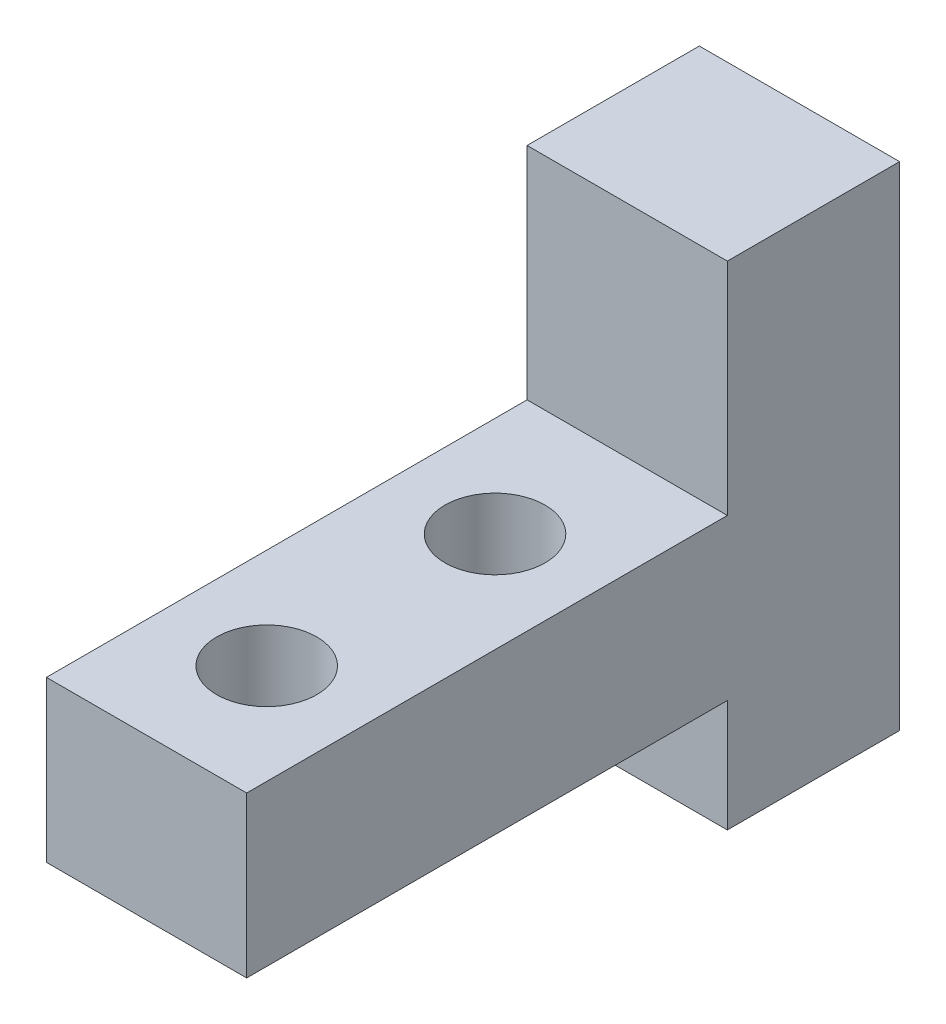
ISO-10303-21;
HEADER;
FILE_DESCRIPTION(('STEP AP214'),'2;1');
FILE_NAME('part.step','',(''),(''),'','','');
FILE_SCHEMA(('AUTOMOTIVE_DESIGN { 1 0 10303 214 1 1 1 1 }'));
ENDSEC;
DATA;
#1=APPLICATION_CONTEXT('core data for automotive mechanical design processes');
#2=APPLICATION_PROTOCOL_DEFINITION('international standard','automotive_design',2000,#1);
#3=PRODUCT_CONTEXT('',#1,'mechanical');
#4=PRODUCT('Part','Part','',(#3));
#5=PRODUCT_RELATED_PRODUCT_CATEGORY('part','',(#4));
#6=PRODUCT_DEFINITION_FORMATION('','',#4);
#7=PRODUCT_DEFINITION_CONTEXT('part definition',#1,'design');
#8=PRODUCT_DEFINITION('design','',#6,#7);
#9=PRODUCT_DEFINITION_SHAPE('','',#8);
#10=(LENGTH_UNIT() NAMED_UNIT(*) SI_UNIT(.MILLI.,.METRE.));
#11=(NAMED_UNIT(*) PLANE_ANGLE_UNIT() SI_UNIT($,.RADIAN.));
#12=(NAMED_UNIT(*) SI_UNIT($,.STERADIAN.) SOLID_ANGLE_UNIT());
#13=UNCERTAINTY_MEASURE_WITH_UNIT(LENGTH_MEASURE(1.E-05),#10,'distance_accuracy_value','');
#14=(GEOMETRIC_REPRESENTATION_CONTEXT(3) GLOBAL_UNCERTAINTY_ASSIGNED_CONTEXT((#13)) GLOBAL_UNIT_ASSIGNED_CONTEXT((#10,
#11,#12)) REPRESENTATION_CONTEXT('',''));
#15=CARTESIAN_POINT('',(0.,0.,0.));
#16=DIRECTION('',(0.,0.,1.));
#17=DIRECTION('',(1.,0.,0.));
#18=AXIS2_PLACEMENT_3D('',#15,#16,#17);
#19=CARTESIAN_POINT('',(0.,-2.1,10.5));
#20=DIRECTION('',(0.,-1.,0.));
#21=DIRECTION('',(-1.,0.,0.));
#22=AXIS2_PLACEMENT_3D('',#19,#20,#21);
#23=CYLINDRICAL_SURFACE('',#22,1.25);
#24=CARTESIAN_POINT('',(0.,-7.6,10.5));
#25=DIRECTION('',(0.,-1.,0.));
#26=DIRECTION('',(0.,0.,1.));
#27=AXIS2_PLACEMENT_3D('',#24,#25,#26);
#28=CIRCLE('',#27,1.25);
#29=CARTESIAN_POINT('',(-1.25,-7.6,10.5));
#30=VERTEX_POINT('',#29);
#31=EDGE_CURVE('E42',#30,#30,#28,.T.);
#32=ORIENTED_EDGE('',*,*,#31,.F.);
#33=EDGE_LOOP('',(#32));
#34=FACE_BOUND('',#33,.T.);
#35=CARTESIAN_POINT('',(0.,-11.6,10.5));
#36=DIRECTION('',(0.,-1.,0.));
#37=DIRECTION('',(-1.,0.,0.));
#38=AXIS2_PLACEMENT_3D('',#35,#36,#37);
#39=CIRCLE('',#38,1.25);
#40=CARTESIAN_POINT('',(-1.25,-11.6,10.5));
#41=VERTEX_POINT('',#40);
#42=EDGE_CURVE('E10',#41,#41,#39,.T.);
#43=ORIENTED_EDGE('',*,*,#42,.T.);
#44=EDGE_LOOP('',(#43));
#45=FACE_BOUND('',#44,.T.);
#46=ADVANCED_FACE('F18',(#34,#45),#23,.F.);
#47=CARTESIAN_POINT('',(0.,-2.1,16.2));
#48=DIRECTION('',(0.,-1.,0.));
#49=DIRECTION('',(-1.,0.,0.));
#50=AXIS2_PLACEMENT_3D('',#47,#48,#49);
#51=CYLINDRICAL_SURFACE('',#50,1.25);
#52=CARTESIAN_POINT('',(0.,-7.6,16.2));
#53=DIRECTION('',(0.,-1.,0.));
#54=DIRECTION('',(0.,0.,1.));
#55=AXIS2_PLACEMENT_3D('',#52,#53,#54);
#56=CIRCLE('',#55,1.25);
#57=CARTESIAN_POINT('',(-1.25000000000002,-7.6,16.2));
#58=VERTEX_POINT('',#57);
#59=EDGE_CURVE('E158',#58,#58,#56,.T.);
#60=ORIENTED_EDGE('',*,*,#59,.F.);
#61=EDGE_LOOP('',(#60));
#62=FACE_BOUND('',#61,.T.);
#63=CARTESIAN_POINT('',(0.,-11.6,16.2));
#64=DIRECTION('',(0.,-1.,0.));
#65=DIRECTION('',(-1.,0.,0.));
#66=AXIS2_PLACEMENT_3D('',#63,#64,#65);
#67=CIRCLE('',#66,1.25);
#68=CARTESIAN_POINT('',(-1.25000000000002,-11.6,16.2));
#69=VERTEX_POINT('',#68);
#70=EDGE_CURVE('E29',#69,#69,#67,.T.);
#71=ORIENTED_EDGE('',*,*,#70,.T.);
#72=EDGE_LOOP('',(#71));
#73=FACE_BOUND('',#72,.T.);
#74=ADVANCED_FACE('F277',(#62,#73),#51,.F.);
#75=CARTESIAN_POINT('',(-2.5,-11.6,7.2));
#76=DIRECTION('',(0.,0.,-1.));
#77=DIRECTION('',(0.,-1.,0.));
#78=AXIS2_PLACEMENT_3D('',#75,#76,#77);
#79=PLANE('',#78);
#80=DIRECTION('',(0.,1.,0.));
#81=VECTOR('',#80,1.);
#82=CARTESIAN_POINT('',(2.5,-11.6,7.2));
#83=LINE('',#82,#81);
#84=CARTESIAN_POINT('',(2.5,-14.4,7.2));
#85=VERTEX_POINT('',#84);
#86=CARTESIAN_POINT('',(2.5,-11.6,7.2));
#87=VERTEX_POINT('',#86);
#88=EDGE_CURVE('E171',#85,#87,#83,.T.);
#89=ORIENTED_EDGE('',*,*,#88,.T.);
#90=DIRECTION('',(1.,0.,0.));
#91=VECTOR('',#90,1.);
#92=CARTESIAN_POINT('',(-2.5,-11.6,7.2));
#93=LINE('',#92,#91);
#94=CARTESIAN_POINT('',(-2.5,-11.6,7.2));
#95=VERTEX_POINT('',#94);
#96=EDGE_CURVE('E189',#95,#87,#93,.T.);
#97=ORIENTED_EDGE('',*,*,#96,.F.);
#98=DIRECTION('',(0.,1.,0.));
#99=VECTOR('',#98,1.);
#100=CARTESIAN_POINT('',(-2.5,-11.6,7.2));
#101=LINE('',#100,#99);
#102=CARTESIAN_POINT('',(-2.5,-14.4,7.2));
#103=VERTEX_POINT('',#102);
#104=EDGE_CURVE('E167',#103,#95,#101,.T.);
#105=ORIENTED_EDGE('',*,*,#104,.F.);
#106=DIRECTION('',(1.,0.,0.));
#107=VECTOR('',#106,1.);
#108=CARTESIAN_POINT('',(-2.5,-14.4,7.2));
#109=LINE('',#108,#107);
#110=EDGE_CURVE('E168',#103,#85,#109,.T.);
#111=ORIENTED_EDGE('',*,*,#110,.T.);
#112=EDGE_LOOP('',(#89,#97,#105,#111));
#113=FACE_BOUND('',#112,.T.);
#114=ADVANCED_FACE('F281',(#113),#79,.F.);
#115=CARTESIAN_POINT('',(-2.5,-11.6,19.2));
#116=DIRECTION('',(0.,1.,0.));
#117=DIRECTION('',(0.,0.,1.));
#118=AXIS2_PLACEMENT_3D('',#115,#116,#117);
#119=PLANE('',#118);
#120=DIRECTION('',(0.,0.,1.));
#121=VECTOR('',#120,1.);
#122=CARTESIAN_POINT('',(2.5,-11.6,19.2));
#123=LINE('',#122,#121);
#124=CARTESIAN_POINT('',(2.5,-11.6,19.2));
#125=VERTEX_POINT('',#124);
#126=EDGE_CURVE('E172',#87,#125,#123,.T.);
#127=ORIENTED_EDGE('',*,*,#126,.T.);
#128=DIRECTION('',(1.,0.,0.));
#129=VECTOR('',#128,1.);
#130=CARTESIAN_POINT('',(-2.5,-11.6,19.2));
#131=LINE('',#130,#129);
#132=CARTESIAN_POINT('',(-2.5,-11.6,19.2));
#133=VERTEX_POINT('',#132);
#134=EDGE_CURVE('E208',#133,#125,#131,.T.);
#135=ORIENTED_EDGE('',*,*,#134,.F.);
#136=DIRECTION('',(0.,0.,1.));
#137=VECTOR('',#136,1.);
#138=CARTESIAN_POINT('',(-2.5,-11.6,19.2));
#139=LINE('',#138,#137);
#140=EDGE_CURVE('E161',#95,#133,#139,.T.);
#141=ORIENTED_EDGE('',*,*,#140,.F.);
#142=ORIENTED_EDGE('',*,*,#96,.T.);
#143=EDGE_LOOP('',(#127,#135,#141,#142));
#144=FACE_BOUND('',#143,.T.);
#145=ORIENTED_EDGE('',*,*,#42,.F.);
#146=EDGE_LOOP('',(#145));
#147=FACE_BOUND('',#146,.T.);
#148=ORIENTED_EDGE('',*,*,#70,.F.);
#149=EDGE_LOOP('',(#148));
#150=FACE_BOUND('',#149,.T.);
#151=ADVANCED_FACE('F306',(#144,#147,#150),#119,.F.);
#152=CARTESIAN_POINT('',(-2.5,-7.6,19.2));
#153=DIRECTION('',(0.,0.,-1.));
#154=DIRECTION('',(0.,-1.,0.));
#155=AXIS2_PLACEMENT_3D('',#152,#153,#154);
#156=PLANE('',#155);
#157=DIRECTION('',(0.,1.,0.));
#158=VECTOR('',#157,1.);
#159=CARTESIAN_POINT('',(2.5,-7.6,19.2));
#160=LINE('',#159,#158);
#161=CARTESIAN_POINT('',(2.5,-7.6,19.2));
#162=VERTEX_POINT('',#161);
#163=EDGE_CURVE('E197',#125,#162,#160,.T.);
#164=ORIENTED_EDGE('',*,*,#163,.T.);
#165=DIRECTION('',(1.,0.,0.));
#166=VECTOR('',#165,1.);
#167=CARTESIAN_POINT('',(-2.5,-7.6,19.2));
#168=LINE('',#167,#166);
#169=CARTESIAN_POINT('',(-2.5,-7.6,19.2));
#170=VERTEX_POINT('',#169);
#171=EDGE_CURVE('E162',#170,#162,#168,.T.);
#172=ORIENTED_EDGE('',*,*,#171,.F.);
#173=DIRECTION('',(0.,1.,0.));
#174=VECTOR('',#173,1.);
#175=CARTESIAN_POINT('',(-2.5,-7.6,19.2));
#176=LINE('',#175,#174);
#177=EDGE_CURVE('E124',#133,#170,#176,.T.);
#178=ORIENTED_EDGE('',*,*,#177,.F.);
#179=ORIENTED_EDGE('',*,*,#134,.T.);
#180=EDGE_LOOP('',(#164,#172,#178,#179));
#181=FACE_BOUND('',#180,.T.);
#182=ADVANCED_FACE('F340',(#181),#156,.F.);
#183=CARTESIAN_POINT('',(-2.5,-7.6,7.2));
#184=DIRECTION('',(0.,-1.,0.));
#185=DIRECTION('',(0.,0.,-1.));
#186=AXIS2_PLACEMENT_3D('',#183,#184,#185);
#187=PLANE('',#186);
#188=DIRECTION('',(0.,0.,-1.));
#189=VECTOR('',#188,1.);
#190=CARTESIAN_POINT('',(2.5,-7.6,7.2));
#191=LINE('',#190,#189);
#192=CARTESIAN_POINT('',(2.5,-7.6,7.2));
#193=VERTEX_POINT('',#192);
#194=EDGE_CURVE('E134',#162,#193,#191,.T.);
#195=ORIENTED_EDGE('',*,*,#194,.T.);
#196=DIRECTION('',(1.,0.,0.));
#197=VECTOR('',#196,1.);
#198=CARTESIAN_POINT('',(-2.5,-7.6,7.2));
#199=LINE('',#198,#197);
#200=CARTESIAN_POINT('',(-2.5,-7.6,7.2));
#201=VERTEX_POINT('',#200);
#202=EDGE_CURVE('E130',#201,#193,#199,.T.);
#203=ORIENTED_EDGE('',*,*,#202,.F.);
#204=DIRECTION('',(0.,0.,-1.));
#205=VECTOR('',#204,1.);
#206=CARTESIAN_POINT('',(-2.5,-7.6,7.2));
#207=LINE('',#206,#205);
#208=EDGE_CURVE('E117',#170,#201,#207,.T.);
#209=ORIENTED_EDGE('',*,*,#208,.F.);
#210=ORIENTED_EDGE('',*,*,#171,.T.);
#211=EDGE_LOOP('',(#195,#203,#209,#210));
#212=FACE_BOUND('',#211,.T.);
#213=ORIENTED_EDGE('',*,*,#31,.T.);
#214=EDGE_LOOP('',(#213));
#215=FACE_BOUND('',#214,.T.);
#216=ORIENTED_EDGE('',*,*,#59,.T.);
#217=EDGE_LOOP('',(#216));
#218=FACE_BOUND('',#217,.T.);
#219=ADVANCED_FACE('F131',(#212,#215,#218),#187,.F.);
#220=CARTESIAN_POINT('',(-2.5,-2.1,7.2));
#221=DIRECTION('',(0.,0.,-1.));
#222=DIRECTION('',(0.,-1.,0.));
#223=AXIS2_PLACEMENT_3D('',#220,#221,#222);
#224=PLANE('',#223);
#225=DIRECTION('',(0.,1.,0.));
#226=VECTOR('',#225,1.);
#227=CARTESIAN_POINT('',(2.5,-2.1,7.2));
#228=LINE('',#227,#226);
#229=CARTESIAN_POINT('',(2.5,-2.1,7.2));
#230=VERTEX_POINT('',#229);
#231=EDGE_CURVE('E139',#193,#230,#228,.T.);
#232=ORIENTED_EDGE('',*,*,#231,.T.);
#233=DIRECTION('',(1.,0.,0.));
#234=VECTOR('',#233,1.);
#235=CARTESIAN_POINT('',(-2.5,-2.1,7.2));
#236=LINE('',#235,#234);
#237=CARTESIAN_POINT('',(-2.5,-2.1,7.2));
#238=VERTEX_POINT('',#237);
#239=EDGE_CURVE('E143',#238,#230,#236,.T.);
#240=ORIENTED_EDGE('',*,*,#239,.F.);
#241=DIRECTION('',(0.,1.,0.));
#242=VECTOR('',#241,1.);
#243=CARTESIAN_POINT('',(-2.5,-2.1,7.2));
#244=LINE('',#243,#242);
#245=EDGE_CURVE('E121',#201,#238,#244,.T.);
#246=ORIENTED_EDGE('',*,*,#245,.F.);
#247=ORIENTED_EDGE('',*,*,#202,.T.);
#248=EDGE_LOOP('',(#232,#240,#246,#247));
#249=FACE_BOUND('',#248,.T.);
#250=ADVANCED_FACE('F142',(#249),#224,.F.);
#251=CARTESIAN_POINT('',(-2.5,-2.1,2.9));
#252=DIRECTION('',(0.,-1.,0.));
#253=DIRECTION('',(0.,0.,-1.));
#254=AXIS2_PLACEMENT_3D('',#251,#252,#253);
#255=PLANE('',#254);
#256=DIRECTION('',(0.,0.,-1.));
#257=VECTOR('',#256,1.);
#258=CARTESIAN_POINT('',(2.5,-2.1,2.9));
#259=LINE('',#258,#257);
#260=CARTESIAN_POINT('',(2.5,-2.1,2.9));
#261=VERTEX_POINT('',#260);
#262=EDGE_CURVE('E140',#230,#261,#259,.T.);
#263=ORIENTED_EDGE('',*,*,#262,.T.);
#264=DIRECTION('',(1.,0.,0.));
#265=VECTOR('',#264,1.);
#266=CARTESIAN_POINT('',(-2.5,-2.1,2.9));
#267=LINE('',#266,#265);
#268=CARTESIAN_POINT('',(-2.5,-2.1,2.9));
#269=VERTEX_POINT('',#268);
#270=EDGE_CURVE('E214',#269,#261,#267,.T.);
#271=ORIENTED_EDGE('',*,*,#270,.F.);
#272=DIRECTION('',(0.,0.,-1.));
#273=VECTOR('',#272,1.);
#274=CARTESIAN_POINT('',(-2.5,-2.1,2.9));
#275=LINE('',#274,#273);
#276=EDGE_CURVE('E146',#238,#269,#275,.T.);
#277=ORIENTED_EDGE('',*,*,#276,.F.);
#278=ORIENTED_EDGE('',*,*,#239,.T.);
#279=EDGE_LOOP('',(#263,#271,#277,#278));
#280=FACE_BOUND('',#279,.T.);
#281=ADVANCED_FACE('F328',(#280),#255,.F.);
#282=CARTESIAN_POINT('',(-2.5,-14.4,2.9));
#283=DIRECTION('',(0.,0.,1.));
#284=DIRECTION('',(0.,-1.,0.));
#285=AXIS2_PLACEMENT_3D('',#282,#283,#284);
#286=PLANE('',#285);
#287=DIRECTION('',(0.,-1.,0.));
#288=VECTOR('',#287,1.);
#289=CARTESIAN_POINT('',(2.5,-14.4,2.9));
#290=LINE('',#289,#288);
#291=CARTESIAN_POINT('',(2.5,-14.4,2.9));
#292=VERTEX_POINT('',#291);
#293=EDGE_CURVE('E22',#261,#292,#290,.T.);
#294=ORIENTED_EDGE('',*,*,#293,.T.);
#295=DIRECTION('',(1.,0.,0.));
#296=VECTOR('',#295,1.);
#297=CARTESIAN_POINT('',(-2.5,-14.4,2.9));
#298=LINE('',#297,#296);
#299=CARTESIAN_POINT('',(-2.5,-14.4,2.9));
#300=VERTEX_POINT('',#299);
#301=EDGE_CURVE('E212',#300,#292,#298,.T.);
#302=ORIENTED_EDGE('',*,*,#301,.F.);
#303=DIRECTION('',(0.,-1.,0.));
#304=VECTOR('',#303,1.);
#305=CARTESIAN_POINT('',(-2.5,-14.4,2.9));
#306=LINE('',#305,#304);
#307=EDGE_CURVE('E153',#269,#300,#306,.T.);
#308=ORIENTED_EDGE('',*,*,#307,.F.);
#309=ORIENTED_EDGE('',*,*,#270,.T.);
#310=EDGE_LOOP('',(#294,#302,#308,#309));
#311=FACE_BOUND('',#310,.T.);
#312=ADVANCED_FACE('F20',(#311),#286,.F.);
#313=CARTESIAN_POINT('',(-2.5,-14.4,7.2));
#314=DIRECTION('',(0.,1.,0.));
#315=DIRECTION('',(1.,0.,0.));
#316=AXIS2_PLACEMENT_3D('',#313,#314,#315);
#317=PLANE('',#316);
#318=DIRECTION('',(0.,0.,1.));
#319=VECTOR('',#318,1.);
#320=CARTESIAN_POINT('',(2.5,-14.4,7.2));
#321=LINE('',#320,#319);
#322=EDGE_CURVE('E187',#292,#85,#321,.T.);
#323=ORIENTED_EDGE('',*,*,#322,.T.);
#324=ORIENTED_EDGE('',*,*,#110,.F.);
#325=DIRECTION('',(0.,0.,1.));
#326=VECTOR('',#325,1.);
#327=CARTESIAN_POINT('',(-2.5,-14.4,7.2));
#328=LINE('',#327,#326);
#329=EDGE_CURVE('E220',#300,#103,#328,.T.);
#330=ORIENTED_EDGE('',*,*,#329,.F.);
#331=ORIENTED_EDGE('',*,*,#301,.T.);
#332=EDGE_LOOP('',(#323,#324,#330,#331));
#333=FACE_BOUND('',#332,.T.);
#334=ADVANCED_FACE('F294',(#333),#317,.F.);
#335=CARTESIAN_POINT('',(-2.5,-14.4,7.2));
#336=DIRECTION('',(1.,0.,0.));
#337=DIRECTION('',(0.,1.,0.));
#338=AXIS2_PLACEMENT_3D('',#335,#336,#337);
#339=PLANE('',#338);
#340=ORIENTED_EDGE('',*,*,#104,.T.);
#341=ORIENTED_EDGE('',*,*,#140,.T.);
#342=ORIENTED_EDGE('',*,*,#177,.T.);
#343=ORIENTED_EDGE('',*,*,#208,.T.);
#344=ORIENTED_EDGE('',*,*,#245,.T.);
#345=ORIENTED_EDGE('',*,*,#276,.T.);
#346=ORIENTED_EDGE('',*,*,#307,.T.);
#347=ORIENTED_EDGE('',*,*,#329,.T.);
#348=EDGE_LOOP('',(#340,#341,#342,#343,#344,#345,#346,#347));
#349=FACE_BOUND('',#348,.T.);
#350=ADVANCED_FACE('F119',(#349),#339,.F.);
#351=CARTESIAN_POINT('',(2.5,-14.4,7.2));
#352=DIRECTION('',(1.,0.,0.));
#353=DIRECTION('',(0.,1.,0.));
#354=AXIS2_PLACEMENT_3D('',#351,#352,#353);
#355=PLANE('',#354);
#356=ORIENTED_EDGE('',*,*,#88,.F.);
#357=ORIENTED_EDGE('',*,*,#322,.F.);
#358=ORIENTED_EDGE('',*,*,#293,.F.);
#359=ORIENTED_EDGE('',*,*,#262,.F.);
#360=ORIENTED_EDGE('',*,*,#231,.F.);
#361=ORIENTED_EDGE('',*,*,#194,.F.);
#362=ORIENTED_EDGE('',*,*,#163,.F.);
#363=ORIENTED_EDGE('',*,*,#126,.F.);
#364=EDGE_LOOP('',(#356,#357,#358,#359,#360,#361,#362,#363));
#365=FACE_BOUND('',#364,.T.);
#366=ADVANCED_FACE('F312',(#365),#355,.T.);
#367=CLOSED_SHELL('',(#46,#74,#114,#151,#182,#219,#250,#281,#312,#334,#350,#366));
#368=MANIFOLD_SOLID_BREP('B1',#367);
#369=ADVANCED_BREP_SHAPE_REPRESENTATION('',(#18,#368),#14);
#370=SHAPE_DEFINITION_REPRESENTATION(#9,#369);
ENDSEC;
END-ISO-10303-21;
